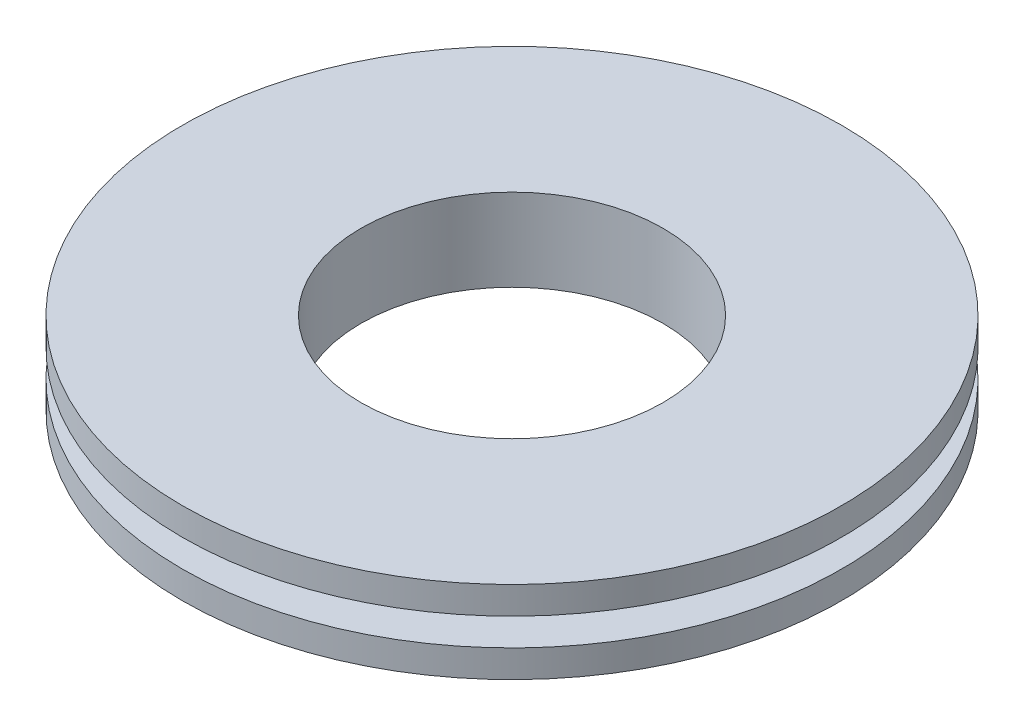
ISO-10303-21;
HEADER;
FILE_DESCRIPTION(('STEP AP214'),'2;1');
FILE_NAME('part.step','',(''),(''),'','','');
FILE_SCHEMA(('AUTOMOTIVE_DESIGN { 1 0 10303 214 1 1 1 1 }'));
ENDSEC;
DATA;
#1=APPLICATION_CONTEXT('core data for automotive mechanical design processes');
#2=APPLICATION_PROTOCOL_DEFINITION('international standard','automotive_design',2000,#1);
#3=PRODUCT_CONTEXT('',#1,'mechanical');
#4=PRODUCT('Part','Part','',(#3));
#5=PRODUCT_RELATED_PRODUCT_CATEGORY('part','',(#4));
#6=PRODUCT_DEFINITION_FORMATION('','',#4);
#7=PRODUCT_DEFINITION_CONTEXT('part definition',#1,'design');
#8=PRODUCT_DEFINITION('design','',#6,#7);
#9=PRODUCT_DEFINITION_SHAPE('','',#8);
#10=(LENGTH_UNIT() NAMED_UNIT(*) SI_UNIT(.MILLI.,.METRE.));
#11=(NAMED_UNIT(*) PLANE_ANGLE_UNIT() SI_UNIT($,.RADIAN.));
#12=(NAMED_UNIT(*) SI_UNIT($,.STERADIAN.) SOLID_ANGLE_UNIT());
#13=UNCERTAINTY_MEASURE_WITH_UNIT(LENGTH_MEASURE(1.E-05),#10,'distance_accuracy_value','');
#14=(GEOMETRIC_REPRESENTATION_CONTEXT(3) GLOBAL_UNCERTAINTY_ASSIGNED_CONTEXT((#13)) GLOBAL_UNIT_ASSIGNED_CONTEXT((#10,
#11,#12)) REPRESENTATION_CONTEXT('',''));
#15=CARTESIAN_POINT('',(0.,0.,0.));
#16=DIRECTION('',(0.,0.,1.));
#17=DIRECTION('',(1.,0.,0.));
#18=AXIS2_PLACEMENT_3D('',#15,#16,#17);
#19=CARTESIAN_POINT('',(0.,3.,0.));
#20=DIRECTION('',(0.,1.,0.));
#21=DIRECTION('',(0.,0.,1.));
#22=AXIS2_PLACEMENT_3D('',#19,#20,#21);
#23=PLANE('',#22);
#24=CARTESIAN_POINT('',(0.,3.,0.));
#25=DIRECTION('',(0.,1.,0.));
#26=DIRECTION('',(0.,0.,1.));
#27=AXIS2_PLACEMENT_3D('',#24,#25,#26);
#28=CIRCLE('',#27,5.5);
#29=CARTESIAN_POINT('',(0.,3.,5.5));
#30=VERTEX_POINT('',#29);
#31=EDGE_CURVE('E57',#30,#30,#28,.T.);
#32=ORIENTED_EDGE('',*,*,#31,.F.);
#33=EDGE_LOOP('',(#32));
#34=FACE_BOUND('',#33,.T.);
#35=CARTESIAN_POINT('',(0.,3.,0.));
#36=DIRECTION('',(0.,1.,0.));
#37=DIRECTION('',(0.,0.,1.));
#38=AXIS2_PLACEMENT_3D('',#35,#36,#37);
#39=CIRCLE('',#38,12.);
#40=CARTESIAN_POINT('',(0.,3.,12.));
#41=VERTEX_POINT('',#40);
#42=EDGE_CURVE('E68',#41,#41,#39,.T.);
#43=ORIENTED_EDGE('',*,*,#42,.T.);
#44=EDGE_LOOP('',(#43));
#45=FACE_BOUND('',#44,.T.);
#46=ADVANCED_FACE('F43',(#34,#45),#23,.T.);
#47=CARTESIAN_POINT('',(0.,0.,0.));
#48=DIRECTION('',(0.,1.,0.));
#49=DIRECTION('',(0.,0.,1.));
#50=AXIS2_PLACEMENT_3D('',#47,#48,#49);
#51=PLANE('',#50);
#52=CARTESIAN_POINT('',(0.,0.,0.));
#53=DIRECTION('',(0.,1.,0.));
#54=DIRECTION('',(0.,0.,1.));
#55=AXIS2_PLACEMENT_3D('',#52,#53,#54);
#56=CIRCLE('',#55,5.5);
#57=CARTESIAN_POINT('',(0.,0.,5.5));
#58=VERTEX_POINT('',#57);
#59=EDGE_CURVE('E60',#58,#58,#56,.T.);
#60=ORIENTED_EDGE('',*,*,#59,.T.);
#61=EDGE_LOOP('',(#60));
#62=FACE_BOUND('',#61,.T.);
#63=CARTESIAN_POINT('',(0.,0.,0.));
#64=DIRECTION('',(0.,-1.,0.));
#65=DIRECTION('',(0.,0.,-1.));
#66=AXIS2_PLACEMENT_3D('',#63,#64,#65);
#67=CIRCLE('',#66,12.);
#68=CARTESIAN_POINT('',(0.,0.,-12.));
#69=VERTEX_POINT('',#68);
#70=EDGE_CURVE('E76',#69,#69,#67,.T.);
#71=ORIENTED_EDGE('',*,*,#70,.T.);
#72=EDGE_LOOP('',(#71));
#73=FACE_BOUND('',#72,.T.);
#74=ADVANCED_FACE('F100',(#62,#73),#51,.F.);
#75=CARTESIAN_POINT('',(0.,3.,0.));
#76=DIRECTION('',(0.,-1.,0.));
#77=DIRECTION('',(0.,0.,-1.));
#78=AXIS2_PLACEMENT_3D('',#75,#76,#77);
#79=CYLINDRICAL_SURFACE('',#78,5.5);
#80=ORIENTED_EDGE('',*,*,#31,.T.);
#81=EDGE_LOOP('',(#80));
#82=FACE_BOUND('',#81,.T.);
#83=ORIENTED_EDGE('',*,*,#59,.F.);
#84=EDGE_LOOP('',(#83));
#85=FACE_BOUND('',#84,.T.);
#86=ADVANCED_FACE('F108',(#82,#85),#79,.F.);
#87=CARTESIAN_POINT('',(0.,2.,0.));
#88=DIRECTION('',(0.,1.,0.));
#89=DIRECTION('',(0.,0.,1.));
#90=AXIS2_PLACEMENT_3D('',#87,#88,#89);
#91=CYLINDRICAL_SURFACE('',#90,12.);
#92=CARTESIAN_POINT('',(0.,2.,0.));
#93=DIRECTION('',(0.,1.,0.));
#94=DIRECTION('',(0.,0.,1.));
#95=AXIS2_PLACEMENT_3D('',#92,#93,#94);
#96=CIRCLE('',#95,12.);
#97=CARTESIAN_POINT('',(0.,2.,12.));
#98=VERTEX_POINT('',#97);
#99=EDGE_CURVE('E64',#98,#98,#96,.T.);
#100=ORIENTED_EDGE('',*,*,#99,.T.);
#101=EDGE_LOOP('',(#100));
#102=FACE_BOUND('',#101,.T.);
#103=ORIENTED_EDGE('',*,*,#42,.F.);
#104=EDGE_LOOP('',(#103));
#105=FACE_BOUND('',#104,.T.);
#106=ADVANCED_FACE('F125',(#102,#105),#91,.T.);
#107=CARTESIAN_POINT('',(0.,2.,0.));
#108=DIRECTION('',(0.,1.,0.));
#109=DIRECTION('',(0.,0.,1.));
#110=AXIS2_PLACEMENT_3D('',#107,#108,#109);
#111=PLANE('',#110);
#112=CARTESIAN_POINT('',(0.,2.,0.));
#113=DIRECTION('',(0.,1.,0.));
#114=DIRECTION('',(0.,0.,1.));
#115=AXIS2_PLACEMENT_3D('',#112,#113,#114);
#116=CIRCLE('',#115,10.5);
#117=CARTESIAN_POINT('',(0.,2.,10.5));
#118=VERTEX_POINT('',#117);
#119=EDGE_CURVE('E52',#118,#118,#116,.T.);
#120=ORIENTED_EDGE('',*,*,#119,.T.);
#121=EDGE_LOOP('',(#120));
#122=FACE_BOUND('',#121,.T.);
#123=ORIENTED_EDGE('',*,*,#99,.F.);
#124=EDGE_LOOP('',(#123));
#125=FACE_BOUND('',#124,.T.);
#126=ADVANCED_FACE('F97',(#122,#125),#111,.F.);
#127=CARTESIAN_POINT('',(0.,1.,0.));
#128=DIRECTION('',(0.,-1.,0.));
#129=DIRECTION('',(0.,0.,-1.));
#130=AXIS2_PLACEMENT_3D('',#127,#128,#129);
#131=CYLINDRICAL_SURFACE('',#130,12.);
#132=CARTESIAN_POINT('',(0.,1.,0.));
#133=DIRECTION('',(0.,-1.,0.));
#134=DIRECTION('',(0.,0.,-1.));
#135=AXIS2_PLACEMENT_3D('',#132,#133,#134);
#136=CIRCLE('',#135,12.);
#137=CARTESIAN_POINT('',(0.,1.,-12.));
#138=VERTEX_POINT('',#137);
#139=EDGE_CURVE('E72',#138,#138,#136,.T.);
#140=ORIENTED_EDGE('',*,*,#139,.T.);
#141=EDGE_LOOP('',(#140));
#142=FACE_BOUND('',#141,.T.);
#143=ORIENTED_EDGE('',*,*,#70,.F.);
#144=EDGE_LOOP('',(#143));
#145=FACE_BOUND('',#144,.T.);
#146=ADVANCED_FACE('F84',(#142,#145),#131,.T.);
#147=CARTESIAN_POINT('',(0.,1.,0.));
#148=DIRECTION('',(0.,-1.,0.));
#149=DIRECTION('',(0.,0.,-1.));
#150=AXIS2_PLACEMENT_3D('',#147,#148,#149);
#151=PLANE('',#150);
#152=CARTESIAN_POINT('',(0.,1.,0.));
#153=DIRECTION('',(0.,-1.,0.));
#154=DIRECTION('',(0.,0.,-1.));
#155=AXIS2_PLACEMENT_3D('',#152,#153,#154);
#156=CIRCLE('',#155,10.5);
#157=CARTESIAN_POINT('',(0.,1.,-10.5));
#158=VERTEX_POINT('',#157);
#159=EDGE_CURVE('E10',#158,#158,#156,.T.);
#160=ORIENTED_EDGE('',*,*,#159,.T.);
#161=EDGE_LOOP('',(#160));
#162=FACE_BOUND('',#161,.T.);
#163=ORIENTED_EDGE('',*,*,#139,.F.);
#164=EDGE_LOOP('',(#163));
#165=FACE_BOUND('',#164,.T.);
#166=ADVANCED_FACE('F87',(#162,#165),#151,.F.);
#167=CARTESIAN_POINT('',(0.,1.5,0.));
#168=DIRECTION('',(0.,-1.,0.));
#169=DIRECTION('',(0.,0.,-1.));
#170=AXIS2_PLACEMENT_3D('',#167,#168,#169);
#171=TOROIDAL_SURFACE('',#170,10.5,0.5);
#172=ORIENTED_EDGE('',*,*,#159,.F.);
#173=EDGE_LOOP('',(#172));
#174=FACE_BOUND('',#173,.T.);
#175=CARTESIAN_POINT('',(0.,1.5,0.));
#176=DIRECTION('',(0.,-1.,0.));
#177=DIRECTION('',(0.,0.,-1.));
#178=AXIS2_PLACEMENT_3D('',#175,#176,#177);
#179=CIRCLE('',#178,10.);
#180=CARTESIAN_POINT('',(0.,1.5,-10.));
#181=VERTEX_POINT('',#180);
#182=EDGE_CURVE('E47',#181,#181,#179,.F.);
#183=ORIENTED_EDGE('',*,*,#182,.F.);
#184=EDGE_LOOP('',(#183));
#185=FACE_BOUND('',#184,.T.);
#186=ADVANCED_FACE('F45',(#174,#185),#171,.F.);
#187=CARTESIAN_POINT('',(0.,1.5,0.));
#188=DIRECTION('',(0.,1.,0.));
#189=DIRECTION('',(0.,0.,1.));
#190=AXIS2_PLACEMENT_3D('',#187,#188,#189);
#191=TOROIDAL_SURFACE('',#190,10.5,0.5);
#192=ORIENTED_EDGE('',*,*,#182,.T.);
#193=EDGE_LOOP('',(#192));
#194=FACE_BOUND('',#193,.T.);
#195=ORIENTED_EDGE('',*,*,#119,.F.);
#196=EDGE_LOOP('',(#195));
#197=FACE_BOUND('',#196,.T.);
#198=ADVANCED_FACE('F94',(#194,#197),#191,.F.);
#199=CLOSED_SHELL('',(#46,#74,#86,#106,#126,#146,#166,#186,#198));
#200=MANIFOLD_SOLID_BREP('B2',#199);
#201=ADVANCED_BREP_SHAPE_REPRESENTATION('',(#18,#200),#14);
#202=SHAPE_DEFINITION_REPRESENTATION(#9,#201);
ENDSEC;
END-ISO-10303-21;
